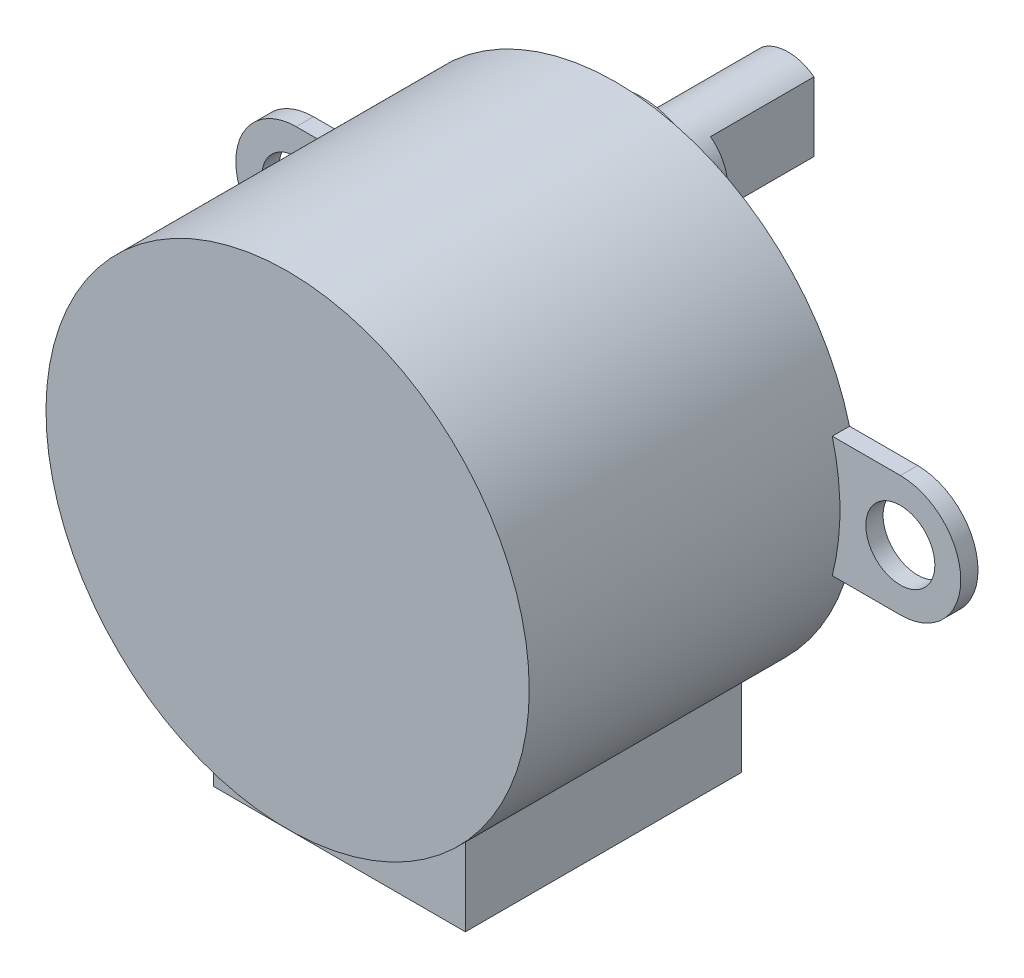
ISO-10303-21;
HEADER;
FILE_DESCRIPTION(('STEP AP214'),'2;1');
FILE_NAME('part.step','',(''),(''),'','','');
FILE_SCHEMA(('AUTOMOTIVE_DESIGN { 1 0 10303 214 1 1 1 1 }'));
ENDSEC;
DATA;
#1=APPLICATION_CONTEXT('core data for automotive mechanical design processes');
#2=APPLICATION_PROTOCOL_DEFINITION('international standard','automotive_design',2000,#1);
#3=PRODUCT_CONTEXT('',#1,'mechanical');
#4=PRODUCT('Part','Part','',(#3));
#5=PRODUCT_RELATED_PRODUCT_CATEGORY('part','',(#4));
#6=PRODUCT_DEFINITION_FORMATION('','',#4);
#7=PRODUCT_DEFINITION_CONTEXT('part definition',#1,'design');
#8=PRODUCT_DEFINITION('design','',#6,#7);
#9=PRODUCT_DEFINITION_SHAPE('','',#8);
#10=(LENGTH_UNIT() NAMED_UNIT(*) SI_UNIT(.MILLI.,.METRE.));
#11=(NAMED_UNIT(*) PLANE_ANGLE_UNIT() SI_UNIT($,.RADIAN.));
#12=(NAMED_UNIT(*) SI_UNIT($,.STERADIAN.) SOLID_ANGLE_UNIT());
#13=UNCERTAINTY_MEASURE_WITH_UNIT(LENGTH_MEASURE(1.E-05),#10,'distance_accuracy_value','');
#14=(GEOMETRIC_REPRESENTATION_CONTEXT(3) GLOBAL_UNCERTAINTY_ASSIGNED_CONTEXT((#13)) GLOBAL_UNIT_ASSIGNED_CONTEXT((#10,
#11,#12)) REPRESENTATION_CONTEXT('',''));
#15=CARTESIAN_POINT('',(0.,0.,0.));
#16=DIRECTION('',(0.,0.,1.));
#17=DIRECTION('',(1.,0.,0.));
#18=AXIS2_PLACEMENT_3D('',#15,#16,#17);
#19=CARTESIAN_POINT('',(0.,0.,1.));
#20=DIRECTION('',(0.,0.,1.));
#21=DIRECTION('',(1.,0.,0.));
#22=AXIS2_PLACEMENT_3D('',#19,#20,#21);
#23=PLANE('',#22);
#24=CARTESIAN_POINT('',(-17.5,0.,1.));
#25=DIRECTION('',(0.,0.,1.));
#26=DIRECTION('',(1.,0.,0.));
#27=AXIS2_PLACEMENT_3D('',#24,#25,#26);
#28=CIRCLE('',#27,2.);
#29=CARTESIAN_POINT('',(-15.5,0.,1.));
#30=VERTEX_POINT('',#29);
#31=EDGE_CURVE('E216',#30,#30,#28,.T.);
#32=ORIENTED_EDGE('',*,*,#31,.F.);
#33=EDGE_LOOP('',(#32));
#34=FACE_BOUND('',#33,.T.);
#35=DIRECTION('',(1.,0.,0.));
#36=VECTOR('',#35,1.);
#37=CARTESIAN_POINT('',(0.,-3.5,1.));
#38=LINE('',#37,#36);
#39=CARTESIAN_POINT('',(-17.5,-3.5,1.));
#40=VERTEX_POINT('',#39);
#41=CARTESIAN_POINT('',(-13.555441711726,-3.5,1.));
#42=VERTEX_POINT('',#41);
#43=EDGE_CURVE('E205',#40,#42,#38,.T.);
#44=ORIENTED_EDGE('',*,*,#43,.T.);
#45=CARTESIAN_POINT('',(0.,0.,1.));
#46=DIRECTION('',(0.,0.,1.));
#47=DIRECTION('',(1.,0.,0.));
#48=AXIS2_PLACEMENT_3D('',#45,#46,#47);
#49=CIRCLE('',#48,14.);
#50=CARTESIAN_POINT('',(-13.555441711726,3.5,1.));
#51=VERTEX_POINT('',#50);
#52=EDGE_CURVE('E194',#42,#51,#49,.F.);
#53=ORIENTED_EDGE('',*,*,#52,.T.);
#54=DIRECTION('',(1.,0.,0.));
#55=VECTOR('',#54,1.);
#56=CARTESIAN_POINT('',(0.,3.5,1.));
#57=LINE('',#56,#55);
#58=CARTESIAN_POINT('',(-17.5,3.5,1.));
#59=VERTEX_POINT('',#58);
#60=EDGE_CURVE('E198',#59,#51,#57,.T.);
#61=ORIENTED_EDGE('',*,*,#60,.F.);
#62=CARTESIAN_POINT('',(-17.5,0.,1.));
#63=DIRECTION('',(0.,0.,1.));
#64=DIRECTION('',(1.,0.,0.));
#65=AXIS2_PLACEMENT_3D('',#62,#63,#64);
#66=CIRCLE('',#65,3.5);
#67=EDGE_CURVE('E202',#40,#59,#66,.F.);
#68=ORIENTED_EDGE('',*,*,#67,.F.);
#69=EDGE_LOOP('',(#44,#53,#61,#68));
#70=FACE_BOUND('',#69,.T.);
#71=ADVANCED_FACE('F36',(#34,#70),#23,.T.);
#72=CARTESIAN_POINT('',(17.5,0.,1.));
#73=DIRECTION('',(0.,0.,1.));
#74=DIRECTION('',(1.,0.,0.));
#75=AXIS2_PLACEMENT_3D('',#72,#73,#74);
#76=CIRCLE('',#75,2.);
#77=CARTESIAN_POINT('',(19.5,0.,1.));
#78=VERTEX_POINT('',#77);
#79=EDGE_CURVE('E213',#78,#78,#76,.T.);
#80=ORIENTED_EDGE('',*,*,#79,.F.);
#81=EDGE_LOOP('',(#80));
#82=FACE_BOUND('',#81,.T.);
#83=DIRECTION('',(-1.,0.,0.));
#84=VECTOR('',#83,1.);
#85=CARTESIAN_POINT('',(0.,3.50000000000001,1.));
#86=LINE('',#85,#84);
#87=CARTESIAN_POINT('',(17.5,3.50000000000001,1.));
#88=VERTEX_POINT('',#87);
#89=CARTESIAN_POINT('',(13.555441711726,3.50000000000001,1.));
#90=VERTEX_POINT('',#89);
#91=EDGE_CURVE('E195',#88,#90,#86,.T.);
#92=ORIENTED_EDGE('',*,*,#91,.T.);
#93=CARTESIAN_POINT('',(13.555441711726,-3.49999999999999,1.));
#94=VERTEX_POINT('',#93);
#95=EDGE_CURVE('E192',#90,#94,#49,.F.);
#96=ORIENTED_EDGE('',*,*,#95,.T.);
#97=DIRECTION('',(-1.,0.,0.));
#98=VECTOR('',#97,1.);
#99=CARTESIAN_POINT('',(0.,-3.49999999999999,1.));
#100=LINE('',#99,#98);
#101=CARTESIAN_POINT('',(17.5,-3.49999999999999,1.));
#102=VERTEX_POINT('',#101);
#103=EDGE_CURVE('E208',#102,#94,#100,.T.);
#104=ORIENTED_EDGE('',*,*,#103,.F.);
#105=CARTESIAN_POINT('',(17.5,0.,1.));
#106=DIRECTION('',(0.,0.,1.));
#107=DIRECTION('',(1.,0.,0.));
#108=AXIS2_PLACEMENT_3D('',#105,#106,#107);
#109=CIRCLE('',#108,3.5);
#110=EDGE_CURVE('E211',#102,#88,#109,.T.);
#111=ORIENTED_EDGE('',*,*,#110,.T.);
#112=EDGE_LOOP('',(#92,#96,#104,#111));
#113=FACE_BOUND('',#112,.T.);
#114=ADVANCED_FACE('F305',(#82,#113),#23,.T.);
#115=CARTESIAN_POINT('',(0.,3.50000000000001,1.));
#116=DIRECTION('',(0.,-1.,0.));
#117=DIRECTION('',(0.,0.,-1.));
#118=AXIS2_PLACEMENT_3D('',#115,#116,#117);
#119=PLANE('',#118);
#120=DIRECTION('',(-1.,0.,0.));
#121=VECTOR('',#120,1.);
#122=CARTESIAN_POINT('',(0.,3.50000000000001,0.));
#123=LINE('',#122,#121);
#124=CARTESIAN_POINT('',(17.5,3.50000000000001,0.));
#125=VERTEX_POINT('',#124);
#126=CARTESIAN_POINT('',(13.555441711726,3.50000000000001,0.));
#127=VERTEX_POINT('',#126);
#128=EDGE_CURVE('E220',#125,#127,#123,.T.);
#129=ORIENTED_EDGE('',*,*,#128,.T.);
#130=DIRECTION('',(0.,0.,-1.));
#131=VECTOR('',#130,1.);
#132=CARTESIAN_POINT('',(13.555441711726,3.50000000000001,1.));
#133=LINE('',#132,#131);
#134=EDGE_CURVE('E278',#90,#127,#133,.T.);
#135=ORIENTED_EDGE('',*,*,#134,.F.);
#136=ORIENTED_EDGE('',*,*,#91,.F.);
#137=DIRECTION('',(0.,0.,-1.));
#138=VECTOR('',#137,1.);
#139=CARTESIAN_POINT('',(17.5,3.50000000000001,1.));
#140=LINE('',#139,#138);
#141=EDGE_CURVE('E219',#88,#125,#140,.T.);
#142=ORIENTED_EDGE('',*,*,#141,.T.);
#143=EDGE_LOOP('',(#129,#135,#136,#142));
#144=FACE_BOUND('',#143,.T.);
#145=ADVANCED_FACE('F38',(#144),#119,.F.);
#146=CARTESIAN_POINT('',(0.,3.5,1.));
#147=DIRECTION('',(0.,1.,0.));
#148=DIRECTION('',(0.,0.,1.));
#149=AXIS2_PLACEMENT_3D('',#146,#147,#148);
#150=PLANE('',#149);
#151=DIRECTION('',(1.,0.,0.));
#152=VECTOR('',#151,1.);
#153=CARTESIAN_POINT('',(0.,3.5,0.));
#154=LINE('',#153,#152);
#155=CARTESIAN_POINT('',(-17.5,3.5,0.));
#156=VERTEX_POINT('',#155);
#157=CARTESIAN_POINT('',(-13.555441711726,3.5,0.));
#158=VERTEX_POINT('',#157);
#159=EDGE_CURVE('E226',#156,#158,#154,.T.);
#160=ORIENTED_EDGE('',*,*,#159,.F.);
#161=DIRECTION('',(0.,0.,-1.));
#162=VECTOR('',#161,1.);
#163=CARTESIAN_POINT('',(-17.5,3.5,1.));
#164=LINE('',#163,#162);
#165=EDGE_CURVE('E274',#59,#156,#164,.T.);
#166=ORIENTED_EDGE('',*,*,#165,.F.);
#167=ORIENTED_EDGE('',*,*,#60,.T.);
#168=DIRECTION('',(0.,0.,-1.));
#169=VECTOR('',#168,1.);
#170=CARTESIAN_POINT('',(-13.555441711726,3.5,1.));
#171=LINE('',#170,#169);
#172=EDGE_CURVE('E276',#51,#158,#171,.T.);
#173=ORIENTED_EDGE('',*,*,#172,.T.);
#174=EDGE_LOOP('',(#160,#166,#167,#173));
#175=FACE_BOUND('',#174,.T.);
#176=ADVANCED_FACE('F360',(#175),#150,.T.);
#177=CARTESIAN_POINT('',(-17.5,0.,1.));
#178=DIRECTION('',(0.,0.,-1.));
#179=DIRECTION('',(-1.,0.,0.));
#180=AXIS2_PLACEMENT_3D('',#177,#178,#179);
#181=CYLINDRICAL_SURFACE('',#180,3.5);
#182=CARTESIAN_POINT('',(-17.5,0.,0.));
#183=DIRECTION('',(0.,0.,1.));
#184=DIRECTION('',(1.,0.,0.));
#185=AXIS2_PLACEMENT_3D('',#182,#183,#184);
#186=CIRCLE('',#185,3.5);
#187=CARTESIAN_POINT('',(-17.5,-3.5,0.));
#188=VERTEX_POINT('',#187);
#189=EDGE_CURVE('E231',#188,#156,#186,.F.);
#190=ORIENTED_EDGE('',*,*,#189,.F.);
#191=DIRECTION('',(0.,0.,-1.));
#192=VECTOR('',#191,1.);
#193=CARTESIAN_POINT('',(-17.5,-3.5,1.));
#194=LINE('',#193,#192);
#195=EDGE_CURVE('E272',#40,#188,#194,.T.);
#196=ORIENTED_EDGE('',*,*,#195,.F.);
#197=ORIENTED_EDGE('',*,*,#67,.T.);
#198=ORIENTED_EDGE('',*,*,#165,.T.);
#199=EDGE_LOOP('',(#190,#196,#197,#198));
#200=FACE_BOUND('',#199,.T.);
#201=ADVANCED_FACE('F357',(#200),#181,.T.);
#202=CARTESIAN_POINT('',(0.,-3.5,1.));
#203=DIRECTION('',(0.,1.,0.));
#204=DIRECTION('',(0.,0.,1.));
#205=AXIS2_PLACEMENT_3D('',#202,#203,#204);
#206=PLANE('',#205);
#207=DIRECTION('',(1.,0.,0.));
#208=VECTOR('',#207,1.);
#209=CARTESIAN_POINT('',(0.,-3.5,0.));
#210=LINE('',#209,#208);
#211=CARTESIAN_POINT('',(-13.555441711726,-3.5,0.));
#212=VERTEX_POINT('',#211);
#213=EDGE_CURVE('E234',#188,#212,#210,.T.);
#214=ORIENTED_EDGE('',*,*,#213,.T.);
#215=DIRECTION('',(0.,0.,-1.));
#216=VECTOR('',#215,1.);
#217=CARTESIAN_POINT('',(-13.555441711726,-3.5,1.));
#218=LINE('',#217,#216);
#219=EDGE_CURVE('E269',#42,#212,#218,.T.);
#220=ORIENTED_EDGE('',*,*,#219,.F.);
#221=ORIENTED_EDGE('',*,*,#43,.F.);
#222=ORIENTED_EDGE('',*,*,#195,.T.);
#223=EDGE_LOOP('',(#214,#220,#221,#222));
#224=FACE_BOUND('',#223,.T.);
#225=ADVANCED_FACE('F353',(#224),#206,.F.);
#226=CARTESIAN_POINT('',(-7.3,0.,1.));
#227=DIRECTION('',(-1.,0.,0.));
#228=DIRECTION('',(0.,-1.,0.));
#229=AXIS2_PLACEMENT_3D('',#226,#227,#228);
#230=PLANE('',#229);
#231=DIRECTION('',(0.,1.,0.));
#232=VECTOR('',#231,1.);
#233=CARTESIAN_POINT('',(-7.3,0.,0.));
#234=LINE('',#233,#232);
#235=CARTESIAN_POINT('',(-7.3,-17.,0.));
#236=VERTEX_POINT('',#235);
#237=CARTESIAN_POINT('',(-7.3,-11.9461290801665,0.));
#238=VERTEX_POINT('',#237);
#239=EDGE_CURVE('E236',#236,#238,#234,.T.);
#240=ORIENTED_EDGE('',*,*,#239,.F.);
#241=DIRECTION('',(0.,0.,-1.));
#242=VECTOR('',#241,1.);
#243=CARTESIAN_POINT('',(-7.3,-17.,1.));
#244=LINE('',#243,#242);
#245=CARTESIAN_POINT('',(-7.3,-17.,16.));
#246=VERTEX_POINT('',#245);
#247=EDGE_CURVE('E265',#246,#236,#244,.T.);
#248=ORIENTED_EDGE('',*,*,#247,.F.);
#249=DIRECTION('',(0.,1.,0.));
#250=VECTOR('',#249,1.);
#251=CARTESIAN_POINT('',(-7.3,0.,16.));
#252=LINE('',#251,#250);
#253=CARTESIAN_POINT('',(-7.3,-11.9461290801665,16.));
#254=VERTEX_POINT('',#253);
#255=EDGE_CURVE('E180',#246,#254,#252,.T.);
#256=ORIENTED_EDGE('',*,*,#255,.T.);
#257=DIRECTION('',(0.,0.,-1.));
#258=VECTOR('',#257,1.);
#259=CARTESIAN_POINT('',(-7.3,-11.9461290801665,1.));
#260=LINE('',#259,#258);
#261=EDGE_CURVE('E267',#254,#238,#260,.T.);
#262=ORIENTED_EDGE('',*,*,#261,.T.);
#263=EDGE_LOOP('',(#240,#248,#256,#262));
#264=FACE_BOUND('',#263,.T.);
#265=ADVANCED_FACE('F349',(#264),#230,.T.);
#266=CARTESIAN_POINT('',(0.,-17.,1.));
#267=DIRECTION('',(0.,1.,0.));
#268=DIRECTION('',(0.,0.,1.));
#269=AXIS2_PLACEMENT_3D('',#266,#267,#268);
#270=PLANE('',#269);
#271=DIRECTION('',(1.,0.,0.));
#272=VECTOR('',#271,1.);
#273=CARTESIAN_POINT('',(0.,-17.,0.));
#274=LINE('',#273,#272);
#275=CARTESIAN_POINT('',(7.3,-17.,0.));
#276=VERTEX_POINT('',#275);
#277=EDGE_CURVE('E239',#236,#276,#274,.T.);
#278=ORIENTED_EDGE('',*,*,#277,.T.);
#279=DIRECTION('',(0.,0.,-1.));
#280=VECTOR('',#279,1.);
#281=CARTESIAN_POINT('',(7.3,-17.,1.));
#282=LINE('',#281,#280);
#283=CARTESIAN_POINT('',(7.3,-17.,16.));
#284=VERTEX_POINT('',#283);
#285=EDGE_CURVE('E262',#284,#276,#282,.T.);
#286=ORIENTED_EDGE('',*,*,#285,.F.);
#287=DIRECTION('',(1.,0.,0.));
#288=VECTOR('',#287,1.);
#289=CARTESIAN_POINT('',(0.,-17.,16.));
#290=LINE('',#289,#288);
#291=EDGE_CURVE('E183',#246,#284,#290,.T.);
#292=ORIENTED_EDGE('',*,*,#291,.F.);
#293=ORIENTED_EDGE('',*,*,#247,.T.);
#294=EDGE_LOOP('',(#278,#286,#292,#293));
#295=FACE_BOUND('',#294,.T.);
#296=ADVANCED_FACE('F345',(#295),#270,.F.);
#297=CARTESIAN_POINT('',(7.3,0.,1.));
#298=DIRECTION('',(-1.,0.,0.));
#299=DIRECTION('',(0.,-1.,0.));
#300=AXIS2_PLACEMENT_3D('',#297,#298,#299);
#301=PLANE('',#300);
#302=DIRECTION('',(0.,1.,0.));
#303=VECTOR('',#302,1.);
#304=CARTESIAN_POINT('',(7.3,0.,0.));
#305=LINE('',#304,#303);
#306=CARTESIAN_POINT('',(7.3,-11.9461290801665,0.));
#307=VERTEX_POINT('',#306);
#308=EDGE_CURVE('E241',#276,#307,#305,.T.);
#309=ORIENTED_EDGE('',*,*,#308,.T.);
#310=DIRECTION('',(0.,0.,-1.));
#311=VECTOR('',#310,1.);
#312=CARTESIAN_POINT('',(7.3,-11.9461290801665,1.));
#313=LINE('',#312,#311);
#314=CARTESIAN_POINT('',(7.3,-11.9461290801665,16.));
#315=VERTEX_POINT('',#314);
#316=EDGE_CURVE('E259',#315,#307,#313,.T.);
#317=ORIENTED_EDGE('',*,*,#316,.F.);
#318=DIRECTION('',(0.,1.,0.));
#319=VECTOR('',#318,1.);
#320=CARTESIAN_POINT('',(7.3,0.,16.));
#321=LINE('',#320,#319);
#322=EDGE_CURVE('E186',#284,#315,#321,.T.);
#323=ORIENTED_EDGE('',*,*,#322,.F.);
#324=ORIENTED_EDGE('',*,*,#285,.T.);
#325=EDGE_LOOP('',(#309,#317,#323,#324));
#326=FACE_BOUND('',#325,.T.);
#327=ADVANCED_FACE('F341',(#326),#301,.F.);
#328=CARTESIAN_POINT('',(0.,0.,1.));
#329=DIRECTION('',(0.,0.,-1.));
#330=DIRECTION('',(-1.,0.,0.));
#331=AXIS2_PLACEMENT_3D('',#328,#329,#330);
#332=CYLINDRICAL_SURFACE('',#331,14.);
#333=ORIENTED_EDGE('',*,*,#261,.F.);
#334=CARTESIAN_POINT('',(0.,0.,16.));
#335=DIRECTION('',(0.,0.,1.));
#336=DIRECTION('',(1.,0.,0.));
#337=AXIS2_PLACEMENT_3D('',#334,#335,#336);
#338=CIRCLE('',#337,14.);
#339=EDGE_CURVE('E174',#254,#315,#338,.T.);
#340=ORIENTED_EDGE('',*,*,#339,.T.);
#341=ORIENTED_EDGE('',*,*,#316,.T.);
#342=CARTESIAN_POINT('',(0.,0.,0.));
#343=DIRECTION('',(0.,0.,1.));
#344=DIRECTION('',(1.,0.,0.));
#345=AXIS2_PLACEMENT_3D('',#342,#343,#344);
#346=CIRCLE('',#345,14.);
#347=CARTESIAN_POINT('',(13.555441711726,-3.49999999999999,0.));
#348=VERTEX_POINT('',#347);
#349=EDGE_CURVE('E227',#307,#348,#346,.T.);
#350=ORIENTED_EDGE('',*,*,#349,.T.);
#351=DIRECTION('',(0.,0.,-1.));
#352=VECTOR('',#351,1.);
#353=CARTESIAN_POINT('',(13.555441711726,-3.49999999999999,1.));
#354=LINE('',#353,#352);
#355=EDGE_CURVE('E257',#94,#348,#354,.T.);
#356=ORIENTED_EDGE('',*,*,#355,.F.);
#357=ORIENTED_EDGE('',*,*,#95,.F.);
#358=ORIENTED_EDGE('',*,*,#134,.T.);
#359=EDGE_CURVE('E223',#127,#158,#346,.T.);
#360=ORIENTED_EDGE('',*,*,#359,.T.);
#361=ORIENTED_EDGE('',*,*,#172,.F.);
#362=ORIENTED_EDGE('',*,*,#52,.F.);
#363=ORIENTED_EDGE('',*,*,#219,.T.);
#364=EDGE_CURVE('E228',#212,#238,#346,.T.);
#365=ORIENTED_EDGE('',*,*,#364,.T.);
#366=EDGE_LOOP('',(#333,#340,#341,#350,#356,#357,#358,#360,#361,#362,#363,#365));
#367=FACE_BOUND('',#366,.T.);
#368=CARTESIAN_POINT('',(0.,0.,19.));
#369=DIRECTION('',(0.,0.,1.));
#370=DIRECTION('',(1.,0.,0.));
#371=AXIS2_PLACEMENT_3D('',#368,#369,#370);
#372=CIRCLE('',#371,14.);
#373=CARTESIAN_POINT('',(14.,0.,19.));
#374=VERTEX_POINT('',#373);
#375=EDGE_CURVE('E189',#374,#374,#372,.T.);
#376=ORIENTED_EDGE('',*,*,#375,.F.);
#377=EDGE_LOOP('',(#376));
#378=FACE_BOUND('',#377,.T.);
#379=ADVANCED_FACE('F337',(#367,#378),#332,.T.);
#380=CARTESIAN_POINT('',(0.,-3.49999999999999,1.));
#381=DIRECTION('',(0.,-1.,0.));
#382=DIRECTION('',(1.,0.,0.));
#383=AXIS2_PLACEMENT_3D('',#380,#381,#382);
#384=PLANE('',#383);
#385=DIRECTION('',(-1.,0.,0.));
#386=VECTOR('',#385,1.);
#387=CARTESIAN_POINT('',(0.,-3.49999999999999,0.));
#388=LINE('',#387,#386);
#389=CARTESIAN_POINT('',(17.5,-3.49999999999999,0.));
#390=VERTEX_POINT('',#389);
#391=EDGE_CURVE('E243',#390,#348,#388,.T.);
#392=ORIENTED_EDGE('',*,*,#391,.F.);
#393=DIRECTION('',(0.,0.,-1.));
#394=VECTOR('',#393,1.);
#395=CARTESIAN_POINT('',(17.5,-3.49999999999999,1.));
#396=LINE('',#395,#394);
#397=EDGE_CURVE('E255',#102,#390,#396,.T.);
#398=ORIENTED_EDGE('',*,*,#397,.F.);
#399=ORIENTED_EDGE('',*,*,#103,.T.);
#400=ORIENTED_EDGE('',*,*,#355,.T.);
#401=EDGE_LOOP('',(#392,#398,#399,#400));
#402=FACE_BOUND('',#401,.T.);
#403=ADVANCED_FACE('F330',(#402),#384,.T.);
#404=CARTESIAN_POINT('',(17.5,0.,1.));
#405=DIRECTION('',(0.,0.,-1.));
#406=DIRECTION('',(-1.,0.,0.));
#407=AXIS2_PLACEMENT_3D('',#404,#405,#406);
#408=CYLINDRICAL_SURFACE('',#407,2.);
#409=ORIENTED_EDGE('',*,*,#79,.T.);
#410=EDGE_LOOP('',(#409));
#411=FACE_BOUND('',#410,.T.);
#412=CARTESIAN_POINT('',(17.5,0.,0.));
#413=DIRECTION('',(0.,0.,1.));
#414=DIRECTION('',(1.,0.,0.));
#415=AXIS2_PLACEMENT_3D('',#412,#413,#414);
#416=CIRCLE('',#415,2.);
#417=CARTESIAN_POINT('',(19.5,0.,0.));
#418=VERTEX_POINT('',#417);
#419=EDGE_CURVE('E248',#418,#418,#416,.T.);
#420=ORIENTED_EDGE('',*,*,#419,.F.);
#421=EDGE_LOOP('',(#420));
#422=FACE_BOUND('',#421,.T.);
#423=ADVANCED_FACE('F327',(#411,#422),#408,.F.);
#424=CARTESIAN_POINT('',(17.5,0.,1.));
#425=DIRECTION('',(0.,0.,-1.));
#426=DIRECTION('',(-1.,0.,0.));
#427=AXIS2_PLACEMENT_3D('',#424,#425,#426);
#428=CYLINDRICAL_SURFACE('',#427,3.5);
#429=CARTESIAN_POINT('',(17.5,0.,0.));
#430=DIRECTION('',(0.,0.,1.));
#431=DIRECTION('',(1.,0.,0.));
#432=AXIS2_PLACEMENT_3D('',#429,#430,#431);
#433=CIRCLE('',#432,3.5);
#434=EDGE_CURVE('E246',#390,#125,#433,.T.);
#435=ORIENTED_EDGE('',*,*,#434,.T.);
#436=ORIENTED_EDGE('',*,*,#141,.F.);
#437=ORIENTED_EDGE('',*,*,#110,.F.);
#438=ORIENTED_EDGE('',*,*,#397,.T.);
#439=EDGE_LOOP('',(#435,#436,#437,#438));
#440=FACE_BOUND('',#439,.T.);
#441=ADVANCED_FACE('F325',(#440),#428,.T.);
#442=CARTESIAN_POINT('',(-17.5,0.,1.));
#443=DIRECTION('',(0.,0.,-1.));
#444=DIRECTION('',(-1.,0.,0.));
#445=AXIS2_PLACEMENT_3D('',#442,#443,#444);
#446=CYLINDRICAL_SURFACE('',#445,2.);
#447=ORIENTED_EDGE('',*,*,#31,.T.);
#448=EDGE_LOOP('',(#447));
#449=FACE_BOUND('',#448,.T.);
#450=CARTESIAN_POINT('',(-17.5,0.,0.));
#451=DIRECTION('',(0.,0.,1.));
#452=DIRECTION('',(1.,0.,0.));
#453=AXIS2_PLACEMENT_3D('',#450,#451,#452);
#454=CIRCLE('',#453,2.);
#455=CARTESIAN_POINT('',(-15.5,0.,0.));
#456=VERTEX_POINT('',#455);
#457=EDGE_CURVE('E199',#456,#456,#454,.T.);
#458=ORIENTED_EDGE('',*,*,#457,.F.);
#459=EDGE_LOOP('',(#458));
#460=FACE_BOUND('',#459,.T.);
#461=ADVANCED_FACE('F321',(#449,#460),#446,.F.);
#462=CARTESIAN_POINT('',(0.,0.,0.));
#463=DIRECTION('',(0.,0.,1.));
#464=DIRECTION('',(1.,0.,0.));
#465=AXIS2_PLACEMENT_3D('',#462,#463,#464);
#466=PLANE('',#465);
#467=CARTESIAN_POINT('',(0.,8.,0.));
#468=DIRECTION('',(0.,0.,1.));
#469=DIRECTION('',(1.,0.,0.));
#470=AXIS2_PLACEMENT_3D('',#467,#468,#469);
#471=CIRCLE('',#470,4.5);
#472=CARTESIAN_POINT('',(4.5,8.,0.));
#473=VERTEX_POINT('',#472);
#474=EDGE_CURVE('E175',#473,#473,#471,.T.);
#475=ORIENTED_EDGE('',*,*,#474,.T.);
#476=EDGE_LOOP('',(#475));
#477=FACE_BOUND('',#476,.T.);
#478=ORIENTED_EDGE('',*,*,#349,.F.);
#479=ORIENTED_EDGE('',*,*,#308,.F.);
#480=ORIENTED_EDGE('',*,*,#277,.F.);
#481=ORIENTED_EDGE('',*,*,#239,.T.);
#482=ORIENTED_EDGE('',*,*,#364,.F.);
#483=ORIENTED_EDGE('',*,*,#213,.F.);
#484=ORIENTED_EDGE('',*,*,#189,.T.);
#485=ORIENTED_EDGE('',*,*,#159,.T.);
#486=ORIENTED_EDGE('',*,*,#359,.F.);
#487=ORIENTED_EDGE('',*,*,#128,.F.);
#488=ORIENTED_EDGE('',*,*,#434,.F.);
#489=ORIENTED_EDGE('',*,*,#391,.T.);
#490=EDGE_LOOP('',(#478,#479,#480,#481,#482,#483,#484,#485,#486,#487,#488,#489));
#491=FACE_BOUND('',#490,.T.);
#492=ORIENTED_EDGE('',*,*,#419,.T.);
#493=EDGE_LOOP('',(#492));
#494=FACE_BOUND('',#493,.T.);
#495=ORIENTED_EDGE('',*,*,#457,.T.);
#496=EDGE_LOOP('',(#495));
#497=FACE_BOUND('',#496,.T.);
#498=ADVANCED_FACE('F318',(#477,#491,#494,#497),#466,.F.);
#499=CARTESIAN_POINT('',(0.,0.,19.));
#500=DIRECTION('',(0.,0.,1.));
#501=DIRECTION('',(1.,0.,0.));
#502=AXIS2_PLACEMENT_3D('',#499,#500,#501);
#503=PLANE('',#502);
#504=ORIENTED_EDGE('',*,*,#375,.T.);
#505=EDGE_LOOP('',(#504));
#506=FACE_BOUND('',#505,.T.);
#507=ADVANCED_FACE('F316',(#506),#503,.T.);
#508=CARTESIAN_POINT('',(0.,0.,16.));
#509=DIRECTION('',(0.,0.,1.));
#510=DIRECTION('',(1.,0.,0.));
#511=AXIS2_PLACEMENT_3D('',#508,#509,#510);
#512=PLANE('',#511);
#513=ORIENTED_EDGE('',*,*,#339,.F.);
#514=ORIENTED_EDGE('',*,*,#255,.F.);
#515=ORIENTED_EDGE('',*,*,#291,.T.);
#516=ORIENTED_EDGE('',*,*,#322,.T.);
#517=EDGE_LOOP('',(#513,#514,#515,#516));
#518=FACE_BOUND('',#517,.T.);
#519=ADVANCED_FACE('F399',(#518),#512,.T.);
#520=CARTESIAN_POINT('',(0.,8.,-1.5));
#521=DIRECTION('',(0.,0.,1.));
#522=DIRECTION('',(1.,0.,0.));
#523=AXIS2_PLACEMENT_3D('',#520,#521,#522);
#524=CYLINDRICAL_SURFACE('',#523,4.5);
#525=CARTESIAN_POINT('',(0.,8.,-1.5));
#526=DIRECTION('',(0.,0.,1.));
#527=DIRECTION('',(1.,0.,0.));
#528=AXIS2_PLACEMENT_3D('',#525,#526,#527);
#529=CIRCLE('',#528,4.5);
#530=CARTESIAN_POINT('',(4.5,8.,-1.5));
#531=VERTEX_POINT('',#530);
#532=EDGE_CURVE('E171',#531,#531,#529,.T.);
#533=ORIENTED_EDGE('',*,*,#532,.T.);
#534=EDGE_LOOP('',(#533));
#535=FACE_BOUND('',#534,.T.);
#536=ORIENTED_EDGE('',*,*,#474,.F.);
#537=EDGE_LOOP('',(#536));
#538=FACE_BOUND('',#537,.T.);
#539=ADVANCED_FACE('F402',(#535,#538),#524,.T.);
#540=CARTESIAN_POINT('',(0.,8.,-1.5));
#541=DIRECTION('',(0.,0.,1.));
#542=DIRECTION('',(1.,0.,0.));
#543=AXIS2_PLACEMENT_3D('',#540,#541,#542);
#544=PLANE('',#543);
#545=CARTESIAN_POINT('',(0.,8.,-1.5));
#546=DIRECTION('',(0.,0.,1.));
#547=DIRECTION('',(1.,0.,0.));
#548=AXIS2_PLACEMENT_3D('',#545,#546,#547);
#549=CIRCLE('',#548,2.5);
#550=CARTESIAN_POINT('',(2.5,8.,-1.5));
#551=VERTEX_POINT('',#550);
#552=EDGE_CURVE('E166',#551,#551,#549,.T.);
#553=ORIENTED_EDGE('',*,*,#552,.T.);
#554=EDGE_LOOP('',(#553));
#555=FACE_BOUND('',#554,.T.);
#556=ORIENTED_EDGE('',*,*,#532,.F.);
#557=EDGE_LOOP('',(#556));
#558=FACE_BOUND('',#557,.T.);
#559=ADVANCED_FACE('F407',(#555,#558),#544,.F.);
#560=CARTESIAN_POINT('',(0.,8.,-10.));
#561=DIRECTION('',(0.,0.,1.));
#562=DIRECTION('',(1.,0.,0.));
#563=AXIS2_PLACEMENT_3D('',#560,#561,#562);
#564=CYLINDRICAL_SURFACE('',#563,2.5);
#565=DIRECTION('',(0.,0.,1.));
#566=VECTOR('',#565,1.);
#567=CARTESIAN_POINT('',(-1.5,10.,-10.));
#568=LINE('',#567,#566);
#569=CARTESIAN_POINT('',(-1.5,10.,-4.));
#570=VERTEX_POINT('',#569);
#571=CARTESIAN_POINT('',(-1.5,10.,-10.));
#572=VERTEX_POINT('',#571);
#573=EDGE_CURVE('E51',#570,#572,#568,.F.);
#574=ORIENTED_EDGE('',*,*,#573,.F.);
#575=CARTESIAN_POINT('',(0.,8.,-4.));
#576=DIRECTION('',(0.,0.,-1.));
#577=DIRECTION('',(-1.,0.,0.));
#578=AXIS2_PLACEMENT_3D('',#575,#576,#577);
#579=CIRCLE('',#578,2.5);
#580=CARTESIAN_POINT('',(-1.5,6.,-4.));
#581=VERTEX_POINT('',#580);
#582=EDGE_CURVE('E11',#570,#581,#579,.F.);
#583=ORIENTED_EDGE('',*,*,#582,.T.);
#584=DIRECTION('',(0.,0.,1.));
#585=VECTOR('',#584,1.);
#586=CARTESIAN_POINT('',(-1.5,6.,-10.));
#587=LINE('',#586,#585);
#588=CARTESIAN_POINT('',(-1.5,6.,-10.));
#589=VERTEX_POINT('',#588);
#590=EDGE_CURVE('E150',#589,#581,#587,.T.);
#591=ORIENTED_EDGE('',*,*,#590,.F.);
#592=CARTESIAN_POINT('',(0.,8.,-10.));
#593=DIRECTION('',(0.,0.,1.));
#594=DIRECTION('',(1.,0.,0.));
#595=AXIS2_PLACEMENT_3D('',#592,#593,#594);
#596=CIRCLE('',#595,2.5);
#597=CARTESIAN_POINT('',(1.5,6.,-10.));
#598=VERTEX_POINT('',#597);
#599=EDGE_CURVE('E59',#589,#598,#596,.T.);
#600=ORIENTED_EDGE('',*,*,#599,.T.);
#601=DIRECTION('',(0.,0.,1.));
#602=VECTOR('',#601,1.);
#603=CARTESIAN_POINT('',(1.5,6.,-10.));
#604=LINE('',#603,#602);
#605=CARTESIAN_POINT('',(1.5,6.,-4.));
#606=VERTEX_POINT('',#605);
#607=EDGE_CURVE('E164',#606,#598,#604,.F.);
#608=ORIENTED_EDGE('',*,*,#607,.F.);
#609=CARTESIAN_POINT('',(0.,8.,-4.));
#610=DIRECTION('',(0.,0.,-1.));
#611=DIRECTION('',(-1.,0.,0.));
#612=AXIS2_PLACEMENT_3D('',#609,#610,#611);
#613=CIRCLE('',#612,2.5);
#614=CARTESIAN_POINT('',(1.5,10.,-4.));
#615=VERTEX_POINT('',#614);
#616=EDGE_CURVE('E155',#606,#615,#613,.F.);
#617=ORIENTED_EDGE('',*,*,#616,.T.);
#618=DIRECTION('',(0.,0.,1.));
#619=VECTOR('',#618,1.);
#620=CARTESIAN_POINT('',(1.5,10.,-10.));
#621=LINE('',#620,#619);
#622=CARTESIAN_POINT('',(1.5,10.,-10.));
#623=VERTEX_POINT('',#622);
#624=EDGE_CURVE('E167',#623,#615,#621,.T.);
#625=ORIENTED_EDGE('',*,*,#624,.F.);
#626=EDGE_CURVE('E163',#623,#572,#596,.T.);
#627=ORIENTED_EDGE('',*,*,#626,.T.);
#628=EDGE_LOOP('',(#574,#583,#591,#600,#608,#617,#625,#627));
#629=FACE_BOUND('',#628,.T.);
#630=ORIENTED_EDGE('',*,*,#552,.F.);
#631=EDGE_LOOP('',(#630));
#632=FACE_BOUND('',#631,.T.);
#633=ADVANCED_FACE('F156',(#629,#632),#564,.T.);
#634=CARTESIAN_POINT('',(0.,8.,-10.));
#635=DIRECTION('',(0.,0.,1.));
#636=DIRECTION('',(1.,0.,0.));
#637=AXIS2_PLACEMENT_3D('',#634,#635,#636);
#638=PLANE('',#637);
#639=ORIENTED_EDGE('',*,*,#599,.F.);
#640=DIRECTION('',(0.,1.,0.));
#641=VECTOR('',#640,1.);
#642=CARTESIAN_POINT('',(-1.5,8.,-10.));
#643=LINE('',#642,#641);
#644=EDGE_CURVE('E44',#589,#572,#643,.T.);
#645=ORIENTED_EDGE('',*,*,#644,.T.);
#646=ORIENTED_EDGE('',*,*,#626,.F.);
#647=DIRECTION('',(0.,-1.,0.));
#648=VECTOR('',#647,1.);
#649=CARTESIAN_POINT('',(1.5,8.,-10.));
#650=LINE('',#649,#648);
#651=EDGE_CURVE('E162',#623,#598,#650,.T.);
#652=ORIENTED_EDGE('',*,*,#651,.T.);
#653=EDGE_LOOP('',(#639,#645,#646,#652));
#654=FACE_BOUND('',#653,.T.);
#655=ADVANCED_FACE('F161',(#654),#638,.F.);
#656=CARTESIAN_POINT('',(1.5,10.5,-4.));
#657=DIRECTION('',(-1.,0.,0.));
#658=DIRECTION('',(0.,-1.,0.));
#659=AXIS2_PLACEMENT_3D('',#656,#657,#658);
#660=PLANE('',#659);
#661=ORIENTED_EDGE('',*,*,#607,.T.);
#662=ORIENTED_EDGE('',*,*,#651,.F.);
#663=ORIENTED_EDGE('',*,*,#624,.T.);
#664=DIRECTION('',(0.,1.,0.));
#665=VECTOR('',#664,1.);
#666=CARTESIAN_POINT('',(1.5,10.5,-4.));
#667=LINE('',#666,#665);
#668=EDGE_CURVE('E290',#606,#615,#667,.T.);
#669=ORIENTED_EDGE('',*,*,#668,.F.);
#670=EDGE_LOOP('',(#661,#662,#663,#669));
#671=FACE_BOUND('',#670,.T.);
#672=ADVANCED_FACE('F292',(#671),#660,.F.);
#673=CARTESIAN_POINT('',(0.,0.,-4.));
#674=DIRECTION('',(0.,0.,-1.));
#675=DIRECTION('',(-1.,0.,0.));
#676=AXIS2_PLACEMENT_3D('',#673,#674,#675);
#677=PLANE('',#676);
#678=ORIENTED_EDGE('',*,*,#668,.T.);
#679=ORIENTED_EDGE('',*,*,#616,.F.);
#680=EDGE_LOOP('',(#678,#679));
#681=FACE_BOUND('',#680,.T.);
#682=ADVANCED_FACE('F289',(#681),#677,.T.);
#683=CARTESIAN_POINT('',(-1.5,10.5,-4.));
#684=DIRECTION('',(1.,0.,0.));
#685=DIRECTION('',(0.,1.,0.));
#686=AXIS2_PLACEMENT_3D('',#683,#684,#685);
#687=PLANE('',#686);
#688=ORIENTED_EDGE('',*,*,#573,.T.);
#689=ORIENTED_EDGE('',*,*,#644,.F.);
#690=ORIENTED_EDGE('',*,*,#590,.T.);
#691=DIRECTION('',(0.,-1.,0.));
#692=VECTOR('',#691,1.);
#693=CARTESIAN_POINT('',(-1.5,10.5,-4.));
#694=LINE('',#693,#692);
#695=EDGE_CURVE('E158',#570,#581,#694,.T.);
#696=ORIENTED_EDGE('',*,*,#695,.F.);
#697=EDGE_LOOP('',(#688,#689,#690,#696));
#698=FACE_BOUND('',#697,.T.);
#699=ADVANCED_FACE('F149',(#698),#687,.F.);
#700=CARTESIAN_POINT('',(0.,0.,-4.));
#701=DIRECTION('',(0.,0.,-1.));
#702=DIRECTION('',(-1.,0.,0.));
#703=AXIS2_PLACEMENT_3D('',#700,#701,#702);
#704=PLANE('',#703);
#705=ORIENTED_EDGE('',*,*,#582,.F.);
#706=ORIENTED_EDGE('',*,*,#695,.T.);
#707=EDGE_LOOP('',(#705,#706));
#708=FACE_BOUND('',#707,.T.);
#709=ADVANCED_FACE('F297',(#708),#704,.T.);
#710=CLOSED_SHELL('',(#71,#114,#145,#176,#201,#225,#265,#296,#327,#379,#403,#423,#441,#461,#498,
#507,#519,#539,#559,#633,#655,#672,#682,#699,#709));
#711=MANIFOLD_SOLID_BREP('B2',#710);
#712=ADVANCED_BREP_SHAPE_REPRESENTATION('',(#18,#711),#14);
#713=SHAPE_DEFINITION_REPRESENTATION(#9,#712);
ENDSEC;
END-ISO-10303-21;
